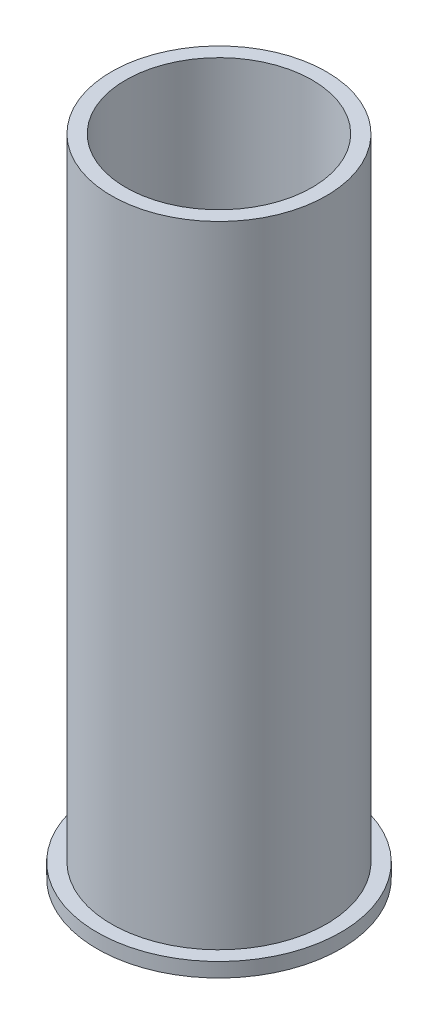
ISO-10303-21;
HEADER;
FILE_DESCRIPTION(('STEP AP214'),'2;1');
FILE_NAME('part.step','',(''),(''),'','','');
FILE_SCHEMA(('AUTOMOTIVE_DESIGN { 1 0 10303 214 1 1 1 1 }'));
ENDSEC;
DATA;
#1=APPLICATION_CONTEXT('core data for automotive mechanical design processes');
#2=APPLICATION_PROTOCOL_DEFINITION('international standard','automotive_design',2000,#1);
#3=PRODUCT_CONTEXT('',#1,'mechanical');
#4=PRODUCT('Part','Part','',(#3));
#5=PRODUCT_RELATED_PRODUCT_CATEGORY('part','',(#4));
#6=PRODUCT_DEFINITION_FORMATION('','',#4);
#7=PRODUCT_DEFINITION_CONTEXT('part definition',#1,'design');
#8=PRODUCT_DEFINITION('design','',#6,#7);
#9=PRODUCT_DEFINITION_SHAPE('','',#8);
#10=(LENGTH_UNIT() NAMED_UNIT(*) SI_UNIT(.MILLI.,.METRE.));
#11=(NAMED_UNIT(*) PLANE_ANGLE_UNIT() SI_UNIT($,.RADIAN.));
#12=(NAMED_UNIT(*) SI_UNIT($,.STERADIAN.) SOLID_ANGLE_UNIT());
#13=UNCERTAINTY_MEASURE_WITH_UNIT(LENGTH_MEASURE(1.E-05),#10,'distance_accuracy_value','');
#14=(GEOMETRIC_REPRESENTATION_CONTEXT(3) GLOBAL_UNCERTAINTY_ASSIGNED_CONTEXT((#13)) GLOBAL_UNIT_ASSIGNED_CONTEXT((#10,
#11,#12)) REPRESENTATION_CONTEXT('',''));
#15=CARTESIAN_POINT('',(0.,0.,0.));
#16=DIRECTION('',(0.,0.,1.));
#17=DIRECTION('',(1.,0.,0.));
#18=AXIS2_PLACEMENT_3D('',#15,#16,#17);
#19=CARTESIAN_POINT('',(0.,0.,0.));
#20=DIRECTION('',(0.,-1.,0.));
#21=DIRECTION('',(0.,0.,-1.));
#22=AXIS2_PLACEMENT_3D('',#19,#20,#21);
#23=CYLINDRICAL_SURFACE('',#22,32.5);
#24=CARTESIAN_POINT('',(0.,-163.860978422006,0.));
#25=DIRECTION('',(0.,-1.,0.));
#26=DIRECTION('',(0.,0.,-1.));
#27=AXIS2_PLACEMENT_3D('',#24,#25,#26);
#28=CIRCLE('',#27,32.5);
#29=CARTESIAN_POINT('',(0.,-163.860978422006,-32.5));
#30=VERTEX_POINT('',#29);
#31=EDGE_CURVE('E10',#30,#30,#28,.T.);
#32=ORIENTED_EDGE('',*,*,#31,.T.);
#33=EDGE_LOOP('',(#32));
#34=FACE_BOUND('',#33,.T.);
#35=CARTESIAN_POINT('',(0.,61.1390215779937,0.));
#36=DIRECTION('',(0.,-1.,0.));
#37=DIRECTION('',(0.,0.,-1.));
#38=AXIS2_PLACEMENT_3D('',#35,#36,#37);
#39=CIRCLE('',#38,32.5);
#40=CARTESIAN_POINT('',(0.,61.1390215779937,-32.5));
#41=VERTEX_POINT('',#40);
#42=EDGE_CURVE('E43',#41,#41,#39,.T.);
#43=ORIENTED_EDGE('',*,*,#42,.F.);
#44=EDGE_LOOP('',(#43));
#45=FACE_BOUND('',#44,.T.);
#46=ADVANCED_FACE('F37',(#34,#45),#23,.F.);
#47=CARTESIAN_POINT('',(32.5,61.1390215779938,0.));
#48=DIRECTION('',(0.,1.,0.));
#49=DIRECTION('',(0.,0.,1.));
#50=AXIS2_PLACEMENT_3D('',#47,#48,#49);
#51=PLANE('',#50);
#52=ORIENTED_EDGE('',*,*,#42,.T.);
#53=EDGE_LOOP('',(#52));
#54=FACE_BOUND('',#53,.T.);
#55=CARTESIAN_POINT('',(0.,61.1390215779938,0.));
#56=DIRECTION('',(0.,-1.,0.));
#57=DIRECTION('',(0.,0.,-1.));
#58=AXIS2_PLACEMENT_3D('',#55,#56,#57);
#59=CIRCLE('',#58,37.5);
#60=CARTESIAN_POINT('',(0.,61.1390215779938,-37.5));
#61=VERTEX_POINT('',#60);
#62=EDGE_CURVE('E47',#61,#61,#59,.T.);
#63=ORIENTED_EDGE('',*,*,#62,.F.);
#64=EDGE_LOOP('',(#63));
#65=FACE_BOUND('',#64,.T.);
#66=ADVANCED_FACE('F80',(#54,#65),#51,.T.);
#67=CARTESIAN_POINT('',(0.,0.,0.));
#68=DIRECTION('',(0.,-1.,0.));
#69=DIRECTION('',(0.,0.,-1.));
#70=AXIS2_PLACEMENT_3D('',#67,#68,#69);
#71=CYLINDRICAL_SURFACE('',#70,37.5);
#72=ORIENTED_EDGE('',*,*,#62,.T.);
#73=EDGE_LOOP('',(#72));
#74=FACE_BOUND('',#73,.T.);
#75=CARTESIAN_POINT('',(0.,-158.860978422006,0.));
#76=DIRECTION('',(0.,-1.,0.));
#77=DIRECTION('',(0.,0.,-1.));
#78=AXIS2_PLACEMENT_3D('',#75,#76,#77);
#79=CIRCLE('',#78,37.5);
#80=CARTESIAN_POINT('',(0.,-158.860978422006,-37.5));
#81=VERTEX_POINT('',#80);
#82=EDGE_CURVE('E51',#81,#81,#79,.T.);
#83=ORIENTED_EDGE('',*,*,#82,.F.);
#84=EDGE_LOOP('',(#83));
#85=FACE_BOUND('',#84,.T.);
#86=ADVANCED_FACE('F76',(#74,#85),#71,.T.);
#87=CARTESIAN_POINT('',(42.5,-158.860978422006,0.));
#88=DIRECTION('',(0.,1.,0.));
#89=DIRECTION('',(0.,0.,1.));
#90=AXIS2_PLACEMENT_3D('',#87,#88,#89);
#91=PLANE('',#90);
#92=ORIENTED_EDGE('',*,*,#82,.T.);
#93=EDGE_LOOP('',(#92));
#94=FACE_BOUND('',#93,.T.);
#95=CARTESIAN_POINT('',(0.,-158.860978422006,0.));
#96=DIRECTION('',(0.,-1.,0.));
#97=DIRECTION('',(0.,0.,-1.));
#98=AXIS2_PLACEMENT_3D('',#95,#96,#97);
#99=CIRCLE('',#98,42.5);
#100=CARTESIAN_POINT('',(0.,-158.860978422006,-42.5));
#101=VERTEX_POINT('',#100);
#102=EDGE_CURVE('E56',#101,#101,#99,.T.);
#103=ORIENTED_EDGE('',*,*,#102,.F.);
#104=EDGE_LOOP('',(#103));
#105=FACE_BOUND('',#104,.T.);
#106=ADVANCED_FACE('F68',(#94,#105),#91,.T.);
#107=CARTESIAN_POINT('',(0.,0.,0.));
#108=DIRECTION('',(0.,-1.,0.));
#109=DIRECTION('',(0.,0.,-1.));
#110=AXIS2_PLACEMENT_3D('',#107,#108,#109);
#111=CYLINDRICAL_SURFACE('',#110,42.5);
#112=ORIENTED_EDGE('',*,*,#102,.T.);
#113=EDGE_LOOP('',(#112));
#114=FACE_BOUND('',#113,.T.);
#115=CARTESIAN_POINT('',(0.,-163.860978422006,0.));
#116=DIRECTION('',(0.,-1.,0.));
#117=DIRECTION('',(0.,0.,-1.));
#118=AXIS2_PLACEMENT_3D('',#115,#116,#117);
#119=CIRCLE('',#118,42.5);
#120=CARTESIAN_POINT('',(0.,-163.860978422006,-42.5));
#121=VERTEX_POINT('',#120);
#122=EDGE_CURVE('E59',#121,#121,#119,.T.);
#123=ORIENTED_EDGE('',*,*,#122,.F.);
#124=EDGE_LOOP('',(#123));
#125=FACE_BOUND('',#124,.T.);
#126=ADVANCED_FACE('F66',(#114,#125),#111,.T.);
#127=CARTESIAN_POINT('',(37.5,-163.860978422006,0.));
#128=DIRECTION('',(0.,-1.,0.));
#129=DIRECTION('',(0.,0.,-1.));
#130=AXIS2_PLACEMENT_3D('',#127,#128,#129);
#131=PLANE('',#130);
#132=ORIENTED_EDGE('',*,*,#122,.T.);
#133=EDGE_LOOP('',(#132));
#134=FACE_BOUND('',#133,.T.);
#135=ORIENTED_EDGE('',*,*,#31,.F.);
#136=EDGE_LOOP('',(#135));
#137=FACE_BOUND('',#136,.T.);
#138=ADVANCED_FACE('F63',(#134,#137),#131,.T.);
#139=CLOSED_SHELL('',(#46,#66,#86,#106,#126,#138));
#140=MANIFOLD_SOLID_BREP('B2',#139);
#141=ADVANCED_BREP_SHAPE_REPRESENTATION('',(#18,#140),#14);
#142=SHAPE_DEFINITION_REPRESENTATION(#9,#141);
ENDSEC;
END-ISO-10303-21;
